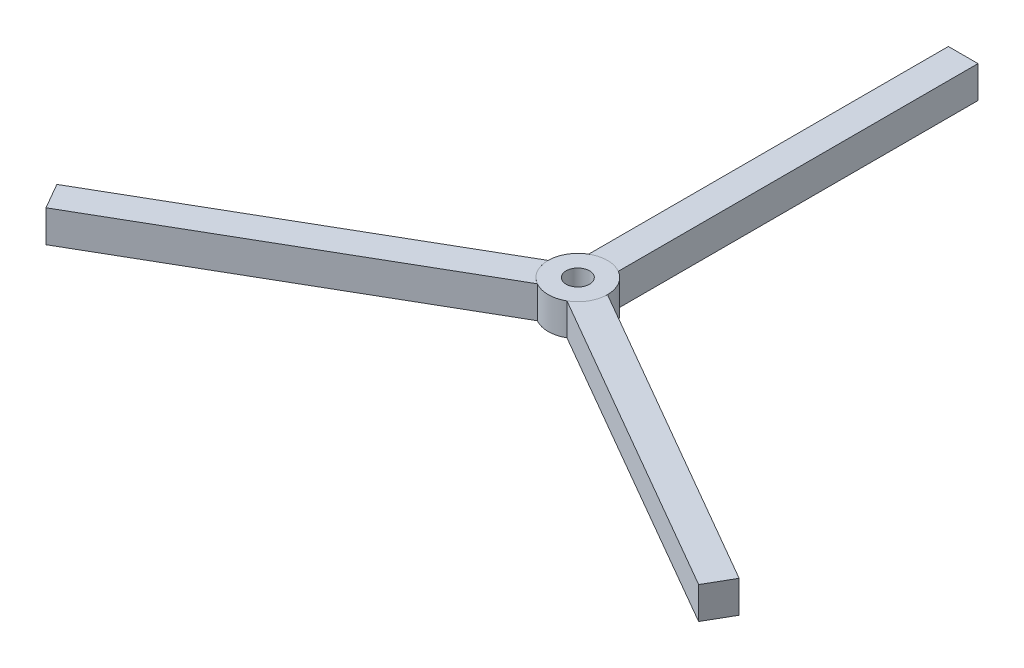
ISO-10303-21;
HEADER;
FILE_DESCRIPTION(('STEP AP214'),'2;1');
FILE_NAME('part.step','',(''),(''),'','','');
FILE_SCHEMA(('AUTOMOTIVE_DESIGN { 1 0 10303 214 1 1 1 1 }'));
ENDSEC;
DATA;
#1=APPLICATION_CONTEXT('core data for automotive mechanical design processes');
#2=APPLICATION_PROTOCOL_DEFINITION('international standard','automotive_design',2000,#1);
#3=PRODUCT_CONTEXT('',#1,'mechanical');
#4=PRODUCT('Part','Part','',(#3));
#5=PRODUCT_RELATED_PRODUCT_CATEGORY('part','',(#4));
#6=PRODUCT_DEFINITION_FORMATION('','',#4);
#7=PRODUCT_DEFINITION_CONTEXT('part definition',#1,'design');
#8=PRODUCT_DEFINITION('design','',#6,#7);
#9=PRODUCT_DEFINITION_SHAPE('','',#8);
#10=(LENGTH_UNIT() NAMED_UNIT(*) SI_UNIT(.MILLI.,.METRE.));
#11=(NAMED_UNIT(*) PLANE_ANGLE_UNIT() SI_UNIT($,.RADIAN.));
#12=(NAMED_UNIT(*) SI_UNIT($,.STERADIAN.) SOLID_ANGLE_UNIT());
#13=UNCERTAINTY_MEASURE_WITH_UNIT(LENGTH_MEASURE(1.E-05),#10,'distance_accuracy_value','');
#14=(GEOMETRIC_REPRESENTATION_CONTEXT(3) GLOBAL_UNCERTAINTY_ASSIGNED_CONTEXT((#13)) GLOBAL_UNIT_ASSIGNED_CONTEXT((#10,
#11,#12)) REPRESENTATION_CONTEXT('',''));
#15=CARTESIAN_POINT('',(0.,0.,0.));
#16=DIRECTION('',(0.,0.,1.));
#17=DIRECTION('',(1.,0.,0.));
#18=AXIS2_PLACEMENT_3D('',#15,#16,#17);
#19=CARTESIAN_POINT('',(69.9028970824058,6.858,44.0246306570149));
#20=DIRECTION('',(0.499999999999992,0.,-0.866025403784443));
#21=DIRECTION('',(0.,-1.,0.));
#22=AXIS2_PLACEMENT_3D('',#19,#20,#21);
#23=PLANE('',#22);
#24=DIRECTION('',(-0.866025403784443,0.,-0.499999999999992));
#25=VECTOR('',#24,1.);
#26=CARTESIAN_POINT('',(69.9028970824058,6.858,44.0246306570149));
#27=LINE('',#26,#25);
#28=CARTESIAN_POINT('',(69.9028970824058,6.858,44.0246306570149));
#29=VERTEX_POINT('',#28);
#30=CARTESIAN_POINT('',(3.17500000000005,6.858,5.49926131403116));
#31=VERTEX_POINT('',#30);
#32=EDGE_CURVE('E111',#29,#31,#27,.T.);
#33=ORIENTED_EDGE('',*,*,#32,.T.);
#34=DIRECTION('',(0.,-1.,0.));
#35=VECTOR('',#34,1.);
#36=CARTESIAN_POINT('',(3.17500000000005,6.858,5.49926131403116));
#37=LINE('',#36,#35);
#38=CARTESIAN_POINT('',(3.17500000000005,0.,5.49926131403116));
#39=VERTEX_POINT('',#38);
#40=EDGE_CURVE('E102',#31,#39,#37,.T.);
#41=ORIENTED_EDGE('',*,*,#40,.T.);
#42=DIRECTION('',(-0.866025403784443,0.,-0.499999999999992));
#43=VECTOR('',#42,1.);
#44=CARTESIAN_POINT('',(69.9028970824058,0.,44.0246306570149));
#45=LINE('',#44,#43);
#46=CARTESIAN_POINT('',(69.9028970824058,0.,44.0246306570149));
#47=VERTEX_POINT('',#46);
#48=EDGE_CURVE('E12',#47,#39,#45,.T.);
#49=ORIENTED_EDGE('',*,*,#48,.F.);
#50=DIRECTION('',(0.,-1.,0.));
#51=VECTOR('',#50,1.);
#52=CARTESIAN_POINT('',(69.9028970824058,6.858,44.0246306570149));
#53=LINE('',#52,#51);
#54=EDGE_CURVE('E104',#29,#47,#53,.T.);
#55=ORIENTED_EDGE('',*,*,#54,.F.);
#56=EDGE_LOOP('',(#33,#41,#49,#55));
#57=FACE_BOUND('',#56,.T.);
#58=ADVANCED_FACE('F43',(#57),#23,.F.);
#59=CARTESIAN_POINT('',(69.9028970824058,0.,44.0246306570149));
#60=DIRECTION('',(0.,1.,0.));
#61=DIRECTION('',(-0.866025403784443,0.,-0.499999999999992));
#62=AXIS2_PLACEMENT_3D('',#59,#60,#61);
#63=PLANE('',#62);
#64=ORIENTED_EDGE('',*,*,#48,.T.);
#65=CARTESIAN_POINT('',(0.,0.,0.));
#66=DIRECTION('',(0.,-1.,0.));
#67=DIRECTION('',(0.866025403784443,0.,0.499999999999992));
#68=AXIS2_PLACEMENT_3D('',#65,#66,#67);
#69=CIRCLE('',#68,6.35);
#70=CARTESIAN_POINT('',(6.35,0.,0.));
#71=VERTEX_POINT('',#70);
#72=EDGE_CURVE('E89',#39,#71,#69,.F.);
#73=ORIENTED_EDGE('',*,*,#72,.T.);
#74=DIRECTION('',(-0.866025403784443,0.,-0.499999999999992));
#75=VECTOR('',#74,1.);
#76=CARTESIAN_POINT('',(73.0778970824058,0.,38.5253693429837));
#77=LINE('',#76,#75);
#78=CARTESIAN_POINT('',(73.0778970824058,0.,38.5253693429837));
#79=VERTEX_POINT('',#78);
#80=EDGE_CURVE('E50',#79,#71,#77,.T.);
#81=ORIENTED_EDGE('',*,*,#80,.F.);
#82=DIRECTION('',(0.499999999999992,0.,-0.866025403784443));
#83=VECTOR('',#82,1.);
#84=CARTESIAN_POINT('',(69.9028970824058,0.,44.0246306570149));
#85=LINE('',#84,#83);
#86=EDGE_CURVE('E107',#47,#79,#85,.T.);
#87=ORIENTED_EDGE('',*,*,#86,.F.);
#88=EDGE_LOOP('',(#64,#73,#81,#87));
#89=FACE_BOUND('',#88,.T.);
#90=ADVANCED_FACE('F90',(#89),#63,.F.);
#91=CARTESIAN_POINT('',(73.0778970824058,6.858,38.5253693429837));
#92=DIRECTION('',(-0.499999999999992,0.,0.866025403784443));
#93=DIRECTION('',(0.866025403784443,0.,0.499999999999992));
#94=AXIS2_PLACEMENT_3D('',#91,#92,#93);
#95=PLANE('',#94);
#96=ORIENTED_EDGE('',*,*,#80,.T.);
#97=DIRECTION('',(0.,-1.,0.));
#98=VECTOR('',#97,1.);
#99=CARTESIAN_POINT('',(6.35,6.858,0.));
#100=LINE('',#99,#98);
#101=CARTESIAN_POINT('',(6.35,6.858,0.));
#102=VERTEX_POINT('',#101);
#103=EDGE_CURVE('E85',#71,#102,#100,.F.);
#104=ORIENTED_EDGE('',*,*,#103,.T.);
#105=DIRECTION('',(-0.866025403784443,0.,-0.499999999999992));
#106=VECTOR('',#105,1.);
#107=CARTESIAN_POINT('',(73.0778970824058,6.858,38.5253693429837));
#108=LINE('',#107,#106);
#109=CARTESIAN_POINT('',(73.0778970824058,6.858,38.5253693429837));
#110=VERTEX_POINT('',#109);
#111=EDGE_CURVE('E87',#110,#102,#108,.T.);
#112=ORIENTED_EDGE('',*,*,#111,.F.);
#113=DIRECTION('',(0.,1.,0.));
#114=VECTOR('',#113,1.);
#115=CARTESIAN_POINT('',(73.0778970824058,6.858,38.5253693429837));
#116=LINE('',#115,#114);
#117=EDGE_CURVE('E62',#79,#110,#116,.T.);
#118=ORIENTED_EDGE('',*,*,#117,.F.);
#119=EDGE_LOOP('',(#96,#104,#112,#118));
#120=FACE_BOUND('',#119,.T.);
#121=ADVANCED_FACE('F83',(#120),#95,.F.);
#122=CARTESIAN_POINT('',(69.9028970824058,6.858,44.0246306570149));
#123=DIRECTION('',(0.,-1.,0.));
#124=DIRECTION('',(0.866025403784443,0.,0.499999999999992));
#125=AXIS2_PLACEMENT_3D('',#122,#123,#124);
#126=PLANE('',#125);
#127=ORIENTED_EDGE('',*,*,#111,.T.);
#128=CARTESIAN_POINT('',(0.,6.858,0.));
#129=DIRECTION('',(0.,1.,0.));
#130=DIRECTION('',(-0.866025403784443,0.,-0.499999999999992));
#131=AXIS2_PLACEMENT_3D('',#128,#129,#130);
#132=CIRCLE('',#131,6.35);
#133=EDGE_CURVE('E95',#102,#31,#132,.F.);
#134=ORIENTED_EDGE('',*,*,#133,.T.);
#135=ORIENTED_EDGE('',*,*,#32,.F.);
#136=DIRECTION('',(-0.499999999999992,0.,0.866025403784443));
#137=VECTOR('',#136,1.);
#138=CARTESIAN_POINT('',(69.9028970824058,6.858,44.0246306570149));
#139=LINE('',#138,#137);
#140=EDGE_CURVE('E57',#110,#29,#139,.T.);
#141=ORIENTED_EDGE('',*,*,#140,.F.);
#142=EDGE_LOOP('',(#127,#134,#135,#141));
#143=FACE_BOUND('',#142,.T.);
#144=ADVANCED_FACE('F114',(#143),#126,.F.);
#145=CARTESIAN_POINT('',(71.4903970824058,0.,41.2749999999993));
#146=DIRECTION('',(0.866025403784443,0.,0.499999999999992));
#147=DIRECTION('',(0.499999999999992,0.,-0.866025403784443));
#148=AXIS2_PLACEMENT_3D('',#145,#146,#147);
#149=PLANE('',#148);
#150=ORIENTED_EDGE('',*,*,#54,.T.);
#151=ORIENTED_EDGE('',*,*,#86,.T.);
#152=ORIENTED_EDGE('',*,*,#117,.T.);
#153=ORIENTED_EDGE('',*,*,#140,.T.);
#154=EDGE_LOOP('',(#150,#151,#152,#153));
#155=FACE_BOUND('',#154,.T.);
#156=ADVANCED_FACE('F117',(#155),#149,.T.);
#157=CARTESIAN_POINT('',(0.,6.858,0.));
#158=DIRECTION('',(0.,-1.,0.));
#159=DIRECTION('',(0.866025403784443,0.,0.499999999999992));
#160=AXIS2_PLACEMENT_3D('',#157,#158,#159);
#161=CYLINDRICAL_SURFACE('',#160,6.35);
#162=ORIENTED_EDGE('',*,*,#133,.F.);
#163=ORIENTED_EDGE('',*,*,#103,.F.);
#164=ORIENTED_EDGE('',*,*,#72,.F.);
#165=ORIENTED_EDGE('',*,*,#40,.F.);
#166=EDGE_LOOP('',(#162,#163,#164,#165));
#167=FACE_BOUND('',#166,.T.);
#168=ADVANCED_FACE('F98',(#167),#161,.F.);
#169=CLOSED_SHELL('',(#58,#90,#121,#144,#156,#168));
#170=MANIFOLD_SOLID_BREP('B2',#169);
#171=CARTESIAN_POINT('',(-73.0778970824053,6.858,38.5253693429848));
#172=DIRECTION('',(0.500000000000004,0.,0.866025403784436));
#173=DIRECTION('',(0.,-1.,0.));
#174=AXIS2_PLACEMENT_3D('',#171,#172,#173);
#175=PLANE('',#174);
#176=DIRECTION('',(0.866025403784436,0.,-0.500000000000004));
#177=VECTOR('',#176,1.);
#178=CARTESIAN_POINT('',(-73.0778970824053,6.858,38.5253693429848));
#179=LINE('',#178,#177);
#180=CARTESIAN_POINT('',(-73.0778970824053,6.858,38.5253693429848));
#181=VERTEX_POINT('',#180);
#182=CARTESIAN_POINT('',(-6.35,6.858,0.));
#183=VERTEX_POINT('',#182);
#184=EDGE_CURVE('E247',#181,#183,#179,.T.);
#185=ORIENTED_EDGE('',*,*,#184,.T.);
#186=DIRECTION('',(0.,-1.,0.));
#187=VECTOR('',#186,1.);
#188=CARTESIAN_POINT('',(-6.35,6.858,0.));
#189=LINE('',#188,#187);
#190=CARTESIAN_POINT('',(-6.35,0.,0.));
#191=VERTEX_POINT('',#190);
#192=EDGE_CURVE('E238',#183,#191,#189,.T.);
#193=ORIENTED_EDGE('',*,*,#192,.T.);
#194=DIRECTION('',(0.866025403784436,0.,-0.500000000000004));
#195=VECTOR('',#194,1.);
#196=CARTESIAN_POINT('',(-73.0778970824053,0.,38.5253693429848));
#197=LINE('',#196,#195);
#198=CARTESIAN_POINT('',(-73.0778970824053,0.,38.5253693429848));
#199=VERTEX_POINT('',#198);
#200=EDGE_CURVE('E41',#199,#191,#197,.T.);
#201=ORIENTED_EDGE('',*,*,#200,.F.);
#202=DIRECTION('',(0.,-1.,0.));
#203=VECTOR('',#202,1.);
#204=CARTESIAN_POINT('',(-73.0778970824053,6.858,38.5253693429848));
#205=LINE('',#204,#203);
#206=EDGE_CURVE('E240',#181,#199,#205,.T.);
#207=ORIENTED_EDGE('',*,*,#206,.F.);
#208=EDGE_LOOP('',(#185,#193,#201,#207));
#209=FACE_BOUND('',#208,.T.);
#210=ADVANCED_FACE('F179',(#209),#175,.F.);
#211=CARTESIAN_POINT('',(-73.0778970824053,0.,38.5253693429848));
#212=DIRECTION('',(0.,1.,0.));
#213=DIRECTION('',(0.866025403784436,0.,-0.500000000000004));
#214=AXIS2_PLACEMENT_3D('',#211,#212,#213);
#215=PLANE('',#214);
#216=ORIENTED_EDGE('',*,*,#200,.T.);
#217=CARTESIAN_POINT('',(0.,0.,0.));
#218=DIRECTION('',(0.,-1.,0.));
#219=DIRECTION('',(-0.866025403784436,0.,0.500000000000004));
#220=AXIS2_PLACEMENT_3D('',#217,#218,#219);
#221=CIRCLE('',#220,6.35);
#222=CARTESIAN_POINT('',(-3.17499999999998,0.,5.4992613140312));
#223=VERTEX_POINT('',#222);
#224=EDGE_CURVE('E225',#191,#223,#221,.F.);
#225=ORIENTED_EDGE('',*,*,#224,.T.);
#226=DIRECTION('',(0.866025403784436,0.,-0.500000000000004));
#227=VECTOR('',#226,1.);
#228=CARTESIAN_POINT('',(-69.9028970824052,0.,44.0246306570159));
#229=LINE('',#228,#227);
#230=CARTESIAN_POINT('',(-69.9028970824052,0.,44.0246306570159));
#231=VERTEX_POINT('',#230);
#232=EDGE_CURVE('E186',#231,#223,#229,.T.);
#233=ORIENTED_EDGE('',*,*,#232,.F.);
#234=DIRECTION('',(0.500000000000004,0.,0.866025403784436));
#235=VECTOR('',#234,1.);
#236=CARTESIAN_POINT('',(-73.0778970824053,0.,38.5253693429848));
#237=LINE('',#236,#235);
#238=EDGE_CURVE('E243',#199,#231,#237,.T.);
#239=ORIENTED_EDGE('',*,*,#238,.F.);
#240=EDGE_LOOP('',(#216,#225,#233,#239));
#241=FACE_BOUND('',#240,.T.);
#242=ADVANCED_FACE('F226',(#241),#215,.F.);
#243=CARTESIAN_POINT('',(-69.9028970824052,6.858,44.0246306570159));
#244=DIRECTION('',(-0.500000000000004,0.,-0.866025403784436));
#245=DIRECTION('',(-0.866025403784436,0.,0.500000000000004));
#246=AXIS2_PLACEMENT_3D('',#243,#244,#245);
#247=PLANE('',#246);
#248=ORIENTED_EDGE('',*,*,#232,.T.);
#249=DIRECTION('',(0.,-1.,0.));
#250=VECTOR('',#249,1.);
#251=CARTESIAN_POINT('',(-3.17499999999998,6.858,5.4992613140312));
#252=LINE('',#251,#250);
#253=CARTESIAN_POINT('',(-3.17499999999998,6.858,5.4992613140312));
#254=VERTEX_POINT('',#253);
#255=EDGE_CURVE('E221',#223,#254,#252,.F.);
#256=ORIENTED_EDGE('',*,*,#255,.T.);
#257=DIRECTION('',(0.866025403784436,0.,-0.500000000000004));
#258=VECTOR('',#257,1.);
#259=CARTESIAN_POINT('',(-69.9028970824052,6.858,44.0246306570159));
#260=LINE('',#259,#258);
#261=CARTESIAN_POINT('',(-69.9028970824052,6.858,44.0246306570159));
#262=VERTEX_POINT('',#261);
#263=EDGE_CURVE('E223',#262,#254,#260,.T.);
#264=ORIENTED_EDGE('',*,*,#263,.F.);
#265=DIRECTION('',(0.,1.,0.));
#266=VECTOR('',#265,1.);
#267=CARTESIAN_POINT('',(-69.9028970824052,6.858,44.0246306570159));
#268=LINE('',#267,#266);
#269=EDGE_CURVE('E198',#231,#262,#268,.T.);
#270=ORIENTED_EDGE('',*,*,#269,.F.);
#271=EDGE_LOOP('',(#248,#256,#264,#270));
#272=FACE_BOUND('',#271,.T.);
#273=ADVANCED_FACE('F219',(#272),#247,.F.);
#274=CARTESIAN_POINT('',(-73.0778970824053,6.858,38.5253693429848));
#275=DIRECTION('',(0.,-1.,0.));
#276=DIRECTION('',(-0.866025403784436,0.,0.500000000000004));
#277=AXIS2_PLACEMENT_3D('',#274,#275,#276);
#278=PLANE('',#277);
#279=ORIENTED_EDGE('',*,*,#263,.T.);
#280=CARTESIAN_POINT('',(0.,6.858,0.));
#281=DIRECTION('',(0.,1.,0.));
#282=DIRECTION('',(0.866025403784436,0.,-0.500000000000004));
#283=AXIS2_PLACEMENT_3D('',#280,#281,#282);
#284=CIRCLE('',#283,6.35);
#285=EDGE_CURVE('E231',#254,#183,#284,.F.);
#286=ORIENTED_EDGE('',*,*,#285,.T.);
#287=ORIENTED_EDGE('',*,*,#184,.F.);
#288=DIRECTION('',(-0.500000000000004,0.,-0.866025403784436));
#289=VECTOR('',#288,1.);
#290=CARTESIAN_POINT('',(-73.0778970824053,6.858,38.5253693429848));
#291=LINE('',#290,#289);
#292=EDGE_CURVE('E193',#262,#181,#291,.T.);
#293=ORIENTED_EDGE('',*,*,#292,.F.);
#294=EDGE_LOOP('',(#279,#286,#287,#293));
#295=FACE_BOUND('',#294,.T.);
#296=ADVANCED_FACE('F250',(#295),#278,.F.);
#297=CARTESIAN_POINT('',(-71.4903970824052,0.,41.2750000000003));
#298=DIRECTION('',(-0.866025403784436,0.,0.500000000000004));
#299=DIRECTION('',(0.500000000000004,0.,0.866025403784436));
#300=AXIS2_PLACEMENT_3D('',#297,#298,#299);
#301=PLANE('',#300);
#302=ORIENTED_EDGE('',*,*,#206,.T.);
#303=ORIENTED_EDGE('',*,*,#238,.T.);
#304=ORIENTED_EDGE('',*,*,#269,.T.);
#305=ORIENTED_EDGE('',*,*,#292,.T.);
#306=EDGE_LOOP('',(#302,#303,#304,#305));
#307=FACE_BOUND('',#306,.T.);
#308=ADVANCED_FACE('F253',(#307),#301,.T.);
#309=CARTESIAN_POINT('',(0.,6.858,0.));
#310=DIRECTION('',(0.,-1.,0.));
#311=DIRECTION('',(-0.866025403784436,0.,0.500000000000004));
#312=AXIS2_PLACEMENT_3D('',#309,#310,#311);
#313=CYLINDRICAL_SURFACE('',#312,6.35);
#314=ORIENTED_EDGE('',*,*,#285,.F.);
#315=ORIENTED_EDGE('',*,*,#255,.F.);
#316=ORIENTED_EDGE('',*,*,#224,.F.);
#317=ORIENTED_EDGE('',*,*,#192,.F.);
#318=EDGE_LOOP('',(#314,#315,#316,#317));
#319=FACE_BOUND('',#318,.T.);
#320=ADVANCED_FACE('F234',(#319),#313,.F.);
#321=CLOSED_SHELL('',(#210,#242,#273,#296,#308,#320));
#322=MANIFOLD_SOLID_BREP('B6',#321);
#323=CARTESIAN_POINT('',(3.175,6.858,-82.55));
#324=DIRECTION('',(-1.,0.,0.));
#325=DIRECTION('',(0.,-1.,0.));
#326=AXIS2_PLACEMENT_3D('',#323,#324,#325);
#327=PLANE('',#326);
#328=DIRECTION('',(0.,0.,1.));
#329=VECTOR('',#328,1.);
#330=CARTESIAN_POINT('',(3.175,6.858,-82.55));
#331=LINE('',#330,#329);
#332=CARTESIAN_POINT('',(3.175,6.858,-82.55));
#333=VERTEX_POINT('',#332);
#334=CARTESIAN_POINT('',(3.175,6.858,-5.49926131403118));
#335=VERTEX_POINT('',#334);
#336=EDGE_CURVE('E380',#333,#335,#331,.T.);
#337=ORIENTED_EDGE('',*,*,#336,.T.);
#338=DIRECTION('',(0.,-1.,0.));
#339=VECTOR('',#338,1.);
#340=CARTESIAN_POINT('',(3.175,6.858,-5.49926131403118));
#341=LINE('',#340,#339);
#342=CARTESIAN_POINT('',(3.175,0.,-5.49926131403118));
#343=VERTEX_POINT('',#342);
#344=EDGE_CURVE('E371',#335,#343,#341,.T.);
#345=ORIENTED_EDGE('',*,*,#344,.T.);
#346=DIRECTION('',(0.,0.,1.));
#347=VECTOR('',#346,1.);
#348=CARTESIAN_POINT('',(3.175,0.,-82.55));
#349=LINE('',#348,#347);
#350=CARTESIAN_POINT('',(3.175,0.,-82.55));
#351=VERTEX_POINT('',#350);
#352=EDGE_CURVE('E177',#351,#343,#349,.T.);
#353=ORIENTED_EDGE('',*,*,#352,.F.);
#354=DIRECTION('',(0.,-1.,0.));
#355=VECTOR('',#354,1.);
#356=CARTESIAN_POINT('',(3.175,6.858,-82.55));
#357=LINE('',#356,#355);
#358=EDGE_CURVE('E373',#333,#351,#357,.T.);
#359=ORIENTED_EDGE('',*,*,#358,.F.);
#360=EDGE_LOOP('',(#337,#345,#353,#359));
#361=FACE_BOUND('',#360,.T.);
#362=ADVANCED_FACE('F312',(#361),#327,.F.);
#363=CARTESIAN_POINT('',(3.175,0.,-82.55));
#364=DIRECTION('',(0.,1.,0.));
#365=DIRECTION('',(0.,0.,1.));
#366=AXIS2_PLACEMENT_3D('',#363,#364,#365);
#367=PLANE('',#366);
#368=ORIENTED_EDGE('',*,*,#352,.T.);
#369=CARTESIAN_POINT('',(0.,0.,0.));
#370=DIRECTION('',(0.,-1.,0.));
#371=DIRECTION('',(0.,0.,-1.));
#372=AXIS2_PLACEMENT_3D('',#369,#370,#371);
#373=CIRCLE('',#372,6.35);
#374=CARTESIAN_POINT('',(-3.175,0.,-5.49926131403119));
#375=VERTEX_POINT('',#374);
#376=EDGE_CURVE('E358',#343,#375,#373,.F.);
#377=ORIENTED_EDGE('',*,*,#376,.T.);
#378=DIRECTION('',(0.,0.,1.));
#379=VECTOR('',#378,1.);
#380=CARTESIAN_POINT('',(-3.175,0.,-82.55));
#381=LINE('',#380,#379);
#382=CARTESIAN_POINT('',(-3.175,0.,-82.55));
#383=VERTEX_POINT('',#382);
#384=EDGE_CURVE('E319',#383,#375,#381,.T.);
#385=ORIENTED_EDGE('',*,*,#384,.F.);
#386=DIRECTION('',(-1.,0.,0.));
#387=VECTOR('',#386,1.);
#388=CARTESIAN_POINT('',(3.175,0.,-82.55));
#389=LINE('',#388,#387);
#390=EDGE_CURVE('E376',#351,#383,#389,.T.);
#391=ORIENTED_EDGE('',*,*,#390,.F.);
#392=EDGE_LOOP('',(#368,#377,#385,#391));
#393=FACE_BOUND('',#392,.T.);
#394=ADVANCED_FACE('F359',(#393),#367,.F.);
#395=CARTESIAN_POINT('',(-3.175,6.858,-82.55));
#396=DIRECTION('',(1.,0.,0.));
#397=DIRECTION('',(0.,0.,-1.));
#398=AXIS2_PLACEMENT_3D('',#395,#396,#397);
#399=PLANE('',#398);
#400=ORIENTED_EDGE('',*,*,#384,.T.);
#401=DIRECTION('',(0.,-1.,0.));
#402=VECTOR('',#401,1.);
#403=CARTESIAN_POINT('',(-3.175,6.858,-5.49926131403119));
#404=LINE('',#403,#402);
#405=CARTESIAN_POINT('',(-3.175,6.858,-5.49926131403119));
#406=VERTEX_POINT('',#405);
#407=EDGE_CURVE('E354',#375,#406,#404,.F.);
#408=ORIENTED_EDGE('',*,*,#407,.T.);
#409=DIRECTION('',(0.,0.,1.));
#410=VECTOR('',#409,1.);
#411=CARTESIAN_POINT('',(-3.175,6.858,-82.55));
#412=LINE('',#411,#410);
#413=CARTESIAN_POINT('',(-3.175,6.858,-82.55));
#414=VERTEX_POINT('',#413);
#415=EDGE_CURVE('E356',#414,#406,#412,.T.);
#416=ORIENTED_EDGE('',*,*,#415,.F.);
#417=DIRECTION('',(0.,1.,0.));
#418=VECTOR('',#417,1.);
#419=CARTESIAN_POINT('',(-3.175,6.858,-82.55));
#420=LINE('',#419,#418);
#421=EDGE_CURVE('E331',#383,#414,#420,.T.);
#422=ORIENTED_EDGE('',*,*,#421,.F.);
#423=EDGE_LOOP('',(#400,#408,#416,#422));
#424=FACE_BOUND('',#423,.T.);
#425=ADVANCED_FACE('F352',(#424),#399,.F.);
#426=CARTESIAN_POINT('',(3.175,6.858,-82.55));
#427=DIRECTION('',(0.,-1.,0.));
#428=DIRECTION('',(0.,0.,-1.));
#429=AXIS2_PLACEMENT_3D('',#426,#427,#428);
#430=PLANE('',#429);
#431=ORIENTED_EDGE('',*,*,#415,.T.);
#432=CARTESIAN_POINT('',(0.,6.858,0.));
#433=DIRECTION('',(0.,1.,0.));
#434=DIRECTION('',(0.,0.,1.));
#435=AXIS2_PLACEMENT_3D('',#432,#433,#434);
#436=CIRCLE('',#435,6.35);
#437=EDGE_CURVE('E364',#406,#335,#436,.F.);
#438=ORIENTED_EDGE('',*,*,#437,.T.);
#439=ORIENTED_EDGE('',*,*,#336,.F.);
#440=DIRECTION('',(1.,0.,0.));
#441=VECTOR('',#440,1.);
#442=CARTESIAN_POINT('',(3.175,6.858,-82.55));
#443=LINE('',#442,#441);
#444=EDGE_CURVE('E326',#414,#333,#443,.T.);
#445=ORIENTED_EDGE('',*,*,#444,.F.);
#446=EDGE_LOOP('',(#431,#438,#439,#445));
#447=FACE_BOUND('',#446,.T.);
#448=ADVANCED_FACE('F383',(#447),#430,.F.);
#449=CARTESIAN_POINT('',(0.,0.,-82.55));
#450=DIRECTION('',(0.,0.,-1.));
#451=DIRECTION('',(-1.,0.,0.));
#452=AXIS2_PLACEMENT_3D('',#449,#450,#451);
#453=PLANE('',#452);
#454=ORIENTED_EDGE('',*,*,#358,.T.);
#455=ORIENTED_EDGE('',*,*,#390,.T.);
#456=ORIENTED_EDGE('',*,*,#421,.T.);
#457=ORIENTED_EDGE('',*,*,#444,.T.);
#458=EDGE_LOOP('',(#454,#455,#456,#457));
#459=FACE_BOUND('',#458,.T.);
#460=ADVANCED_FACE('F386',(#459),#453,.T.);
#461=CARTESIAN_POINT('',(0.,6.858,0.));
#462=DIRECTION('',(0.,-1.,0.));
#463=DIRECTION('',(0.,0.,-1.));
#464=AXIS2_PLACEMENT_3D('',#461,#462,#463);
#465=CYLINDRICAL_SURFACE('',#464,6.35);
#466=ORIENTED_EDGE('',*,*,#437,.F.);
#467=ORIENTED_EDGE('',*,*,#407,.F.);
#468=ORIENTED_EDGE('',*,*,#376,.F.);
#469=ORIENTED_EDGE('',*,*,#344,.F.);
#470=EDGE_LOOP('',(#466,#467,#468,#469));
#471=FACE_BOUND('',#470,.T.);
#472=ADVANCED_FACE('F367',(#471),#465,.F.);
#473=CLOSED_SHELL('',(#362,#394,#425,#448,#460,#472));
#474=MANIFOLD_SOLID_BREP('B35',#473);
#475=CARTESIAN_POINT('',(0.,6.858,0.));
#476=DIRECTION('',(0.,1.,0.));
#477=DIRECTION('',(0.,0.,1.));
#478=AXIS2_PLACEMENT_3D('',#475,#476,#477);
#479=PLANE('',#478);
#480=CARTESIAN_POINT('',(0.,6.858,0.));
#481=DIRECTION('',(0.,1.,0.));
#482=DIRECTION('',(0.,0.,1.));
#483=AXIS2_PLACEMENT_3D('',#480,#481,#482);
#484=CIRCLE('',#483,6.35);
#485=CARTESIAN_POINT('',(0.,6.858,6.35));
#486=VERTEX_POINT('',#485);
#487=EDGE_CURVE('E311',#486,#486,#484,.T.);
#488=ORIENTED_EDGE('',*,*,#487,.T.);
#489=EDGE_LOOP('',(#488));
#490=FACE_BOUND('',#489,.T.);
#491=CARTESIAN_POINT('',(0.,6.858,0.));
#492=DIRECTION('',(0.,1.,0.));
#493=DIRECTION('',(0.,0.,1.));
#494=AXIS2_PLACEMENT_3D('',#491,#492,#493);
#495=CIRCLE('',#494,2.499995);
#496=CARTESIAN_POINT('',(0.,6.858,2.499995));
#497=VERTEX_POINT('',#496);
#498=EDGE_CURVE('E449',#497,#497,#495,.T.);
#499=ORIENTED_EDGE('',*,*,#498,.F.);
#500=EDGE_LOOP('',(#499));
#501=FACE_BOUND('',#500,.T.);
#502=ADVANCED_FACE('F438',(#490,#501),#479,.T.);
#503=CARTESIAN_POINT('',(0.,0.,0.));
#504=DIRECTION('',(0.,1.,0.));
#505=DIRECTION('',(0.,0.,1.));
#506=AXIS2_PLACEMENT_3D('',#503,#504,#505);
#507=PLANE('',#506);
#508=CARTESIAN_POINT('',(0.,0.,0.));
#509=DIRECTION('',(0.,1.,0.));
#510=DIRECTION('',(0.,0.,1.));
#511=AXIS2_PLACEMENT_3D('',#508,#509,#510);
#512=CIRCLE('',#511,6.35);
#513=CARTESIAN_POINT('',(0.,0.,6.35));
#514=VERTEX_POINT('',#513);
#515=EDGE_CURVE('E442',#514,#514,#512,.T.);
#516=ORIENTED_EDGE('',*,*,#515,.F.);
#517=EDGE_LOOP('',(#516));
#518=FACE_BOUND('',#517,.T.);
#519=CARTESIAN_POINT('',(0.,0.,0.));
#520=DIRECTION('',(0.,1.,0.));
#521=DIRECTION('',(0.,0.,1.));
#522=AXIS2_PLACEMENT_3D('',#519,#520,#521);
#523=CIRCLE('',#522,2.499995);
#524=CARTESIAN_POINT('',(0.,0.,2.499995));
#525=VERTEX_POINT('',#524);
#526=EDGE_CURVE('E451',#525,#525,#523,.T.);
#527=ORIENTED_EDGE('',*,*,#526,.T.);
#528=EDGE_LOOP('',(#527));
#529=FACE_BOUND('',#528,.T.);
#530=ADVANCED_FACE('F461',(#518,#529),#507,.F.);
#531=CARTESIAN_POINT('',(0.,6.858,0.));
#532=DIRECTION('',(0.,-1.,0.));
#533=DIRECTION('',(0.,0.,-1.));
#534=AXIS2_PLACEMENT_3D('',#531,#532,#533);
#535=CYLINDRICAL_SURFACE('',#534,6.35);
#536=ORIENTED_EDGE('',*,*,#487,.F.);
#537=EDGE_LOOP('',(#536));
#538=FACE_BOUND('',#537,.T.);
#539=ORIENTED_EDGE('',*,*,#515,.T.);
#540=EDGE_LOOP('',(#539));
#541=FACE_BOUND('',#540,.T.);
#542=ADVANCED_FACE('F440',(#538,#541),#535,.T.);
#543=CARTESIAN_POINT('',(0.,6.858,0.));
#544=DIRECTION('',(0.,-1.,0.));
#545=DIRECTION('',(0.,0.,-1.));
#546=AXIS2_PLACEMENT_3D('',#543,#544,#545);
#547=CYLINDRICAL_SURFACE('',#546,2.499995);
#548=ORIENTED_EDGE('',*,*,#498,.T.);
#549=EDGE_LOOP('',(#548));
#550=FACE_BOUND('',#549,.T.);
#551=ORIENTED_EDGE('',*,*,#526,.F.);
#552=EDGE_LOOP('',(#551));
#553=FACE_BOUND('',#552,.T.);
#554=ADVANCED_FACE('F457',(#550,#553),#547,.F.);
#555=CLOSED_SHELL('',(#502,#530,#542,#554));
#556=MANIFOLD_SOLID_BREP('B171',#555);
#557=ADVANCED_BREP_SHAPE_REPRESENTATION('',(#18,#170,#322,#474,#556),#14);
#558=SHAPE_DEFINITION_REPRESENTATION(#9,#557);
ENDSEC;
END-ISO-10303-21;
